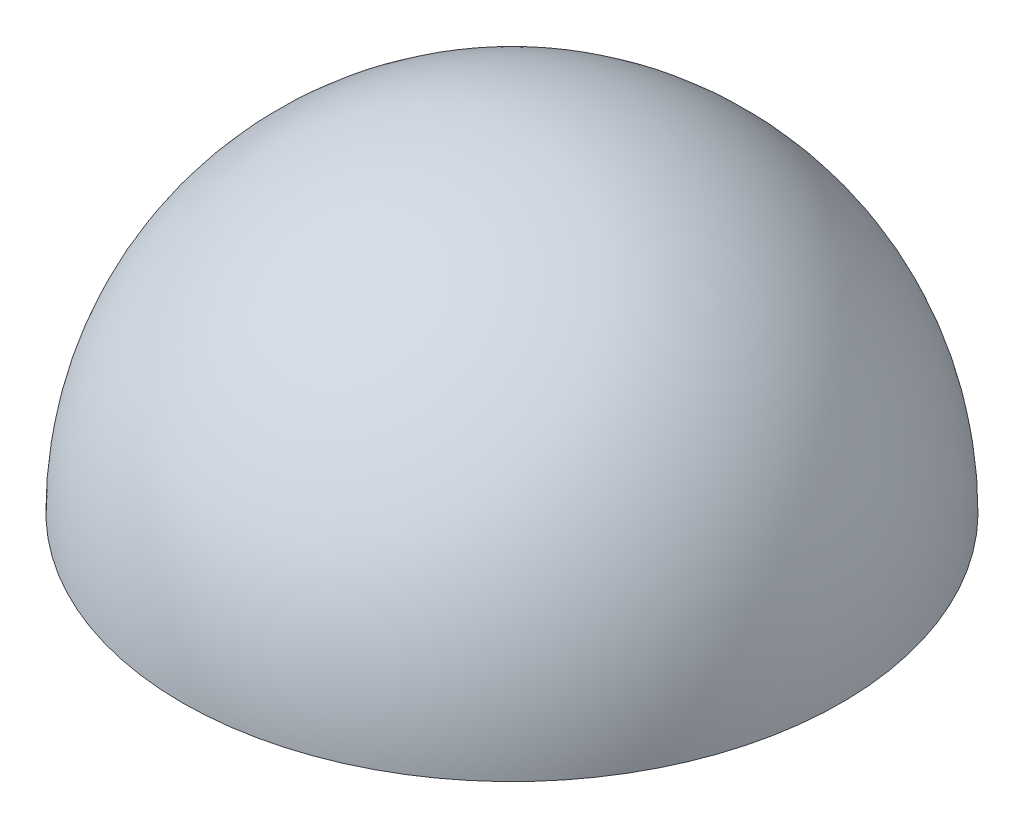
ISO-10303-21;
HEADER;
FILE_DESCRIPTION(('STEP AP214'),'2;1');
FILE_NAME('part.step','',(''),(''),'','','');
FILE_SCHEMA(('AUTOMOTIVE_DESIGN { 1 0 10303 214 1 1 1 1 }'));
ENDSEC;
DATA;
#1=APPLICATION_CONTEXT('core data for automotive mechanical design processes');
#2=APPLICATION_PROTOCOL_DEFINITION('international standard','automotive_design',2000,#1);
#3=PRODUCT_CONTEXT('',#1,'mechanical');
#4=PRODUCT('Part','Part','',(#3));
#5=PRODUCT_RELATED_PRODUCT_CATEGORY('part','',(#4));
#6=PRODUCT_DEFINITION_FORMATION('','',#4);
#7=PRODUCT_DEFINITION_CONTEXT('part definition',#1,'design');
#8=PRODUCT_DEFINITION('design','',#6,#7);
#9=PRODUCT_DEFINITION_SHAPE('','',#8);
#10=(LENGTH_UNIT() NAMED_UNIT(*) SI_UNIT(.MILLI.,.METRE.));
#11=(NAMED_UNIT(*) PLANE_ANGLE_UNIT() SI_UNIT($,.RADIAN.));
#12=(NAMED_UNIT(*) SI_UNIT($,.STERADIAN.) SOLID_ANGLE_UNIT());
#13=UNCERTAINTY_MEASURE_WITH_UNIT(LENGTH_MEASURE(1.E-05),#10,'distance_accuracy_value','');
#14=(GEOMETRIC_REPRESENTATION_CONTEXT(3) GLOBAL_UNCERTAINTY_ASSIGNED_CONTEXT((#13)) GLOBAL_UNIT_ASSIGNED_CONTEXT((#10,
#11,#12)) REPRESENTATION_CONTEXT('',''));
#15=CARTESIAN_POINT('',(0.,0.,0.));
#16=DIRECTION('',(0.,0.,1.));
#17=DIRECTION('',(1.,0.,0.));
#18=AXIS2_PLACEMENT_3D('',#15,#16,#17);
#19=CARTESIAN_POINT('',(0.,0.,0.));
#20=DIRECTION('',(0.,0.,-1.));
#21=DIRECTION('',(-1.,0.,0.));
#22=AXIS2_PLACEMENT_3D('',#19,#20,#21);
#23=SPHERICAL_SURFACE('',#22,0.799999999999999);
#24=CARTESIAN_POINT('',(0.,0.,0.));
#25=DIRECTION('',(0.,-1.,0.));
#26=DIRECTION('',(0.,0.,1.));
#27=AXIS2_PLACEMENT_3D('',#24,#25,#26);
#28=SPHERICAL_SURFACE('',#27,0.799999999999999);
#29=CARTESIAN_POINT('',(0.,0.,0.));
#30=DIRECTION('',(0.,-1.,0.));
#31=DIRECTION('',(0.,0.,1.));
#32=AXIS2_PLACEMENT_3D('',#29,#30,#31);
#33=CIRCLE('',#32,0.799999999999999);
#34=CARTESIAN_POINT('',(0.,0.,0.799999999999999));
#35=VERTEX_POINT('',#34);
#36=EDGE_CURVE('E37',#35,#35,#33,.T.);
#37=ORIENTED_EDGE('',*,*,#36,.F.);
#38=EDGE_LOOP('',(#37));
#39=FACE_BOUND('',#38,.T.);
#40=ADVANCED_FACE('F31',(#39),#28,.T.);
#41=CARTESIAN_POINT('',(0.,0.,0.));
#42=DIRECTION('',(0.,0.,-1.));
#43=DIRECTION('',(-1.,0.,0.));
#44=AXIS2_PLACEMENT_3D('',#41,#42,#43);
#45=SPHERICAL_SURFACE('',#44,0.752871158756727);
#46=CARTESIAN_POINT('',(0.,0.,0.));
#47=DIRECTION('',(0.,-1.,0.));
#48=DIRECTION('',(0.,0.,1.));
#49=AXIS2_PLACEMENT_3D('',#46,#47,#48);
#50=SPHERICAL_SURFACE('',#49,0.752871158756727);
#51=CARTESIAN_POINT('',(0.,0.,0.));
#52=DIRECTION('',(0.,-1.,0.));
#53=DIRECTION('',(0.,0.,1.));
#54=AXIS2_PLACEMENT_3D('',#51,#52,#53);
#55=CIRCLE('',#54,0.752871158756727);
#56=CARTESIAN_POINT('',(0.,0.,0.752871158756727));
#57=VERTEX_POINT('',#56);
#58=EDGE_CURVE('E10',#57,#57,#55,.T.);
#59=ORIENTED_EDGE('',*,*,#58,.T.);
#60=EDGE_LOOP('',(#59));
#61=FACE_BOUND('',#60,.T.);
#62=ADVANCED_FACE('F47',(#61),#50,.F.);
#63=CARTESIAN_POINT('',(0.,0.,0.));
#64=DIRECTION('',(0.,-1.,0.));
#65=DIRECTION('',(0.,0.,1.));
#66=AXIS2_PLACEMENT_3D('',#63,#64,#65);
#67=PLANE('',#66);
#68=ORIENTED_EDGE('',*,*,#36,.T.);
#69=EDGE_LOOP('',(#68));
#70=FACE_BOUND('',#69,.T.);
#71=ORIENTED_EDGE('',*,*,#58,.F.);
#72=EDGE_LOOP('',(#71));
#73=FACE_BOUND('',#72,.T.);
#74=ADVANCED_FACE('F43',(#70,#73),#67,.T.);
#75=CLOSED_SHELL('',(#40,#62,#74));
#76=MANIFOLD_SOLID_BREP('B2',#75);
#77=ADVANCED_BREP_SHAPE_REPRESENTATION('',(#18,#76),#14);
#78=SHAPE_DEFINITION_REPRESENTATION(#9,#77);
ENDSEC;
END-ISO-10303-21;
